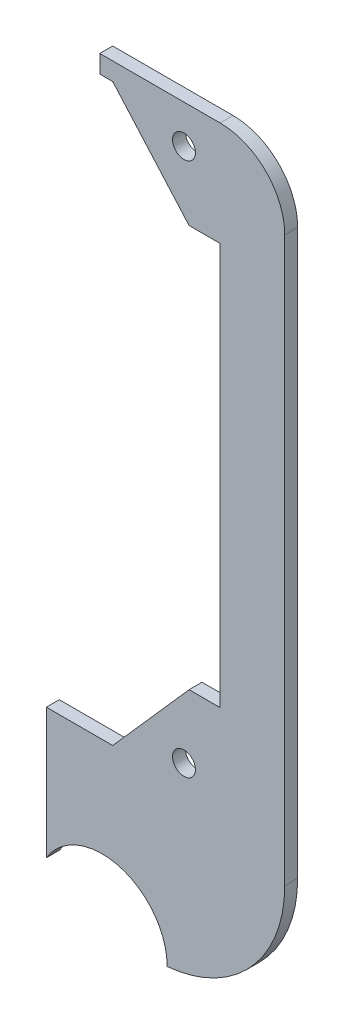
ISO-10303-21;
HEADER;
FILE_DESCRIPTION(('STEP AP214'),'2;1');
FILE_NAME('part.step','',(''),(''),'','','');
FILE_SCHEMA(('AUTOMOTIVE_DESIGN { 1 0 10303 214 1 1 1 1 }'));
ENDSEC;
DATA;
#1=APPLICATION_CONTEXT('core data for automotive mechanical design processes');
#2=APPLICATION_PROTOCOL_DEFINITION('international standard','automotive_design',2000,#1);
#3=PRODUCT_CONTEXT('',#1,'mechanical');
#4=PRODUCT('Part','Part','',(#3));
#5=PRODUCT_RELATED_PRODUCT_CATEGORY('part','',(#4));
#6=PRODUCT_DEFINITION_FORMATION('','',#4);
#7=PRODUCT_DEFINITION_CONTEXT('part definition',#1,'design');
#8=PRODUCT_DEFINITION('design','',#6,#7);
#9=PRODUCT_DEFINITION_SHAPE('','',#8);
#10=(LENGTH_UNIT() NAMED_UNIT(*) SI_UNIT(.MILLI.,.METRE.));
#11=(NAMED_UNIT(*) PLANE_ANGLE_UNIT() SI_UNIT($,.RADIAN.));
#12=(NAMED_UNIT(*) SI_UNIT($,.STERADIAN.) SOLID_ANGLE_UNIT());
#13=UNCERTAINTY_MEASURE_WITH_UNIT(LENGTH_MEASURE(1.E-05),#10,'distance_accuracy_value','');
#14=(GEOMETRIC_REPRESENTATION_CONTEXT(3) GLOBAL_UNCERTAINTY_ASSIGNED_CONTEXT((#13)) GLOBAL_UNIT_ASSIGNED_CONTEXT((#10,
#11,#12)) REPRESENTATION_CONTEXT('',''));
#15=CARTESIAN_POINT('',(0.,0.,0.));
#16=DIRECTION('',(0.,0.,1.));
#17=DIRECTION('',(1.,0.,0.));
#18=AXIS2_PLACEMENT_3D('',#15,#16,#17);
#19=CARTESIAN_POINT('',(-28.3531434966164,-28.9024348313696,2.54));
#20=DIRECTION('',(0.,0.,1.));
#21=DIRECTION('',(1.,0.,0.));
#22=AXIS2_PLACEMENT_3D('',#19,#20,#21);
#23=PLANE('',#22);
#24=CARTESIAN_POINT('',(-12.247498299296,7.37490825521719,2.54));
#25=DIRECTION('',(0.,0.,1.));
#26=DIRECTION('',(1.,0.,0.));
#27=AXIS2_PLACEMENT_3D('',#24,#25,#26);
#28=CIRCLE('',#27,2.25);
#29=CARTESIAN_POINT('',(-9.99749829929596,7.37490825521719,2.54));
#30=VERTEX_POINT('',#29);
#31=EDGE_CURVE('E244',#30,#30,#28,.T.);
#32=ORIENTED_EDGE('',*,*,#31,.F.);
#33=EDGE_LOOP('',(#32));
#34=FACE_BOUND('',#33,.T.);
#35=CARTESIAN_POINT('',(-28.3531434966164,-28.9024348313696,2.54));
#36=DIRECTION('',(0.,0.,-1.));
#37=DIRECTION('',(1.,0.,0.));
#38=AXIS2_PLACEMENT_3D('',#35,#36,#37);
#39=CIRCLE('',#38,12.8017722493406);
#40=CARTESIAN_POINT('',(-39.3002225086821,-22.2656559569774,2.54));
#41=VERTEX_POINT('',#40);
#42=CARTESIAN_POINT('',(-15.5513712472759,-28.9024348313696,2.54));
#43=VERTEX_POINT('',#42);
#44=EDGE_CURVE('E253',#41,#43,#39,.T.);
#45=ORIENTED_EDGE('',*,*,#44,.T.);
#46=CARTESIAN_POINT('',(-17.84749796,-3.60643115254483,2.54));
#47=DIRECTION('',(0.,0.,1.));
#48=DIRECTION('',(1.,0.,0.));
#49=AXIS2_PLACEMENT_3D('',#46,#47,#48);
#50=CIRCLE('',#49,25.4);
#51=CARTESIAN_POINT('',(7.55250203999997,-3.60643115254483,2.54));
#52=VERTEX_POINT('',#51);
#53=EDGE_CURVE('E11',#43,#52,#50,.T.);
#54=ORIENTED_EDGE('',*,*,#53,.T.);
#55=DIRECTION('',(0.,1.,0.));
#56=VECTOR('',#55,1.);
#57=CARTESIAN_POINT('',(7.55250203999997,119.888,2.54));
#58=LINE('',#57,#56);
#59=CARTESIAN_POINT('',(7.55250203999997,107.188,2.54));
#60=VERTEX_POINT('',#59);
#61=EDGE_CURVE('E251',#52,#60,#58,.T.);
#62=ORIENTED_EDGE('',*,*,#61,.T.);
#63=CARTESIAN_POINT('',(-5.14749796000003,107.188,2.54));
#64=DIRECTION('',(0.,0.,1.));
#65=DIRECTION('',(1.,0.,0.));
#66=AXIS2_PLACEMENT_3D('',#63,#64,#65);
#67=CIRCLE('',#66,12.7);
#68=CARTESIAN_POINT('',(-5.14749796000003,119.888,2.54));
#69=VERTEX_POINT('',#68);
#70=EDGE_CURVE('E170',#60,#69,#67,.T.);
#71=ORIENTED_EDGE('',*,*,#70,.T.);
#72=DIRECTION('',(-1.,0.,0.));
#73=VECTOR('',#72,1.);
#74=CARTESIAN_POINT('',(0.,119.888,2.54));
#75=LINE('',#74,#73);
#76=CARTESIAN_POINT('',(-28.8013191666399,119.888,2.54));
#77=VERTEX_POINT('',#76);
#78=EDGE_CURVE('E147',#69,#77,#75,.T.);
#79=ORIENTED_EDGE('',*,*,#78,.T.);
#80=DIRECTION('',(0.,-1.,0.));
#81=VECTOR('',#80,1.);
#82=CARTESIAN_POINT('',(-28.8013191666399,119.888,2.54));
#83=LINE('',#82,#81);
#84=CARTESIAN_POINT('',(-28.80131916664,116.374908255217,2.54));
#85=VERTEX_POINT('',#84);
#86=EDGE_CURVE('E142',#77,#85,#83,.T.);
#87=ORIENTED_EDGE('',*,*,#86,.T.);
#88=DIRECTION('',(1.,0.,0.));
#89=VECTOR('',#88,1.);
#90=CARTESIAN_POINT('',(-26.247498299296,116.374908255217,2.54));
#91=LINE('',#90,#89);
#92=CARTESIAN_POINT('',(-26.247498299296,116.374908255217,2.54));
#93=VERTEX_POINT('',#92);
#94=EDGE_CURVE('E132',#85,#93,#91,.T.);
#95=ORIENTED_EDGE('',*,*,#94,.T.);
#96=DIRECTION('',(0.661621637086846,-0.749837855365093,0.));
#97=VECTOR('',#96,1.);
#98=CARTESIAN_POINT('',(-11.247498299296,99.3749082552172,2.54));
#99=LINE('',#98,#97);
#100=CARTESIAN_POINT('',(-11.247498299296,99.3749082552172,2.54));
#101=VERTEX_POINT('',#100);
#102=EDGE_CURVE('E141',#93,#101,#99,.T.);
#103=ORIENTED_EDGE('',*,*,#102,.T.);
#104=DIRECTION('',(1.,0.,0.));
#105=VECTOR('',#104,1.);
#106=CARTESIAN_POINT('',(-5.14749829929598,99.3749082552172,2.54));
#107=LINE('',#106,#105);
#108=CARTESIAN_POINT('',(-5.14749829929598,99.3749082552172,2.54));
#109=VERTEX_POINT('',#108);
#110=EDGE_CURVE('E220',#101,#109,#107,.T.);
#111=ORIENTED_EDGE('',*,*,#110,.T.);
#112=DIRECTION('',(0.,-1.,0.));
#113=VECTOR('',#112,1.);
#114=CARTESIAN_POINT('',(-5.14749829929598,99.3749082552172,2.54));
#115=LINE('',#114,#113);
#116=CARTESIAN_POINT('',(-5.14749829929596,20.3749082552172,2.54));
#117=VERTEX_POINT('',#116);
#118=EDGE_CURVE('E263',#109,#117,#115,.T.);
#119=ORIENTED_EDGE('',*,*,#118,.T.);
#120=DIRECTION('',(-1.,0.,0.));
#121=VECTOR('',#120,1.);
#122=CARTESIAN_POINT('',(-5.14749829929596,20.3749082552172,2.54));
#123=LINE('',#122,#121);
#124=CARTESIAN_POINT('',(-11.247498299296,20.3749082552172,2.54));
#125=VERTEX_POINT('',#124);
#126=EDGE_CURVE('E261',#117,#125,#123,.T.);
#127=ORIENTED_EDGE('',*,*,#126,.T.);
#128=DIRECTION('',(-0.661621637086846,-0.749837855365093,0.));
#129=VECTOR('',#128,1.);
#130=CARTESIAN_POINT('',(-11.247498299296,20.3749082552172,2.54));
#131=LINE('',#130,#129);
#132=CARTESIAN_POINT('',(-26.247498299296,3.37490825521718,2.54));
#133=VERTEX_POINT('',#132);
#134=EDGE_CURVE('E259',#125,#133,#131,.T.);
#135=ORIENTED_EDGE('',*,*,#134,.T.);
#136=DIRECTION('',(-1.,0.,0.));
#137=VECTOR('',#136,1.);
#138=CARTESIAN_POINT('',(-26.247498299296,3.37490825521718,2.54));
#139=LINE('',#138,#137);
#140=CARTESIAN_POINT('',(-39.3002225086821,3.37490825521718,2.54));
#141=VERTEX_POINT('',#140);
#142=EDGE_CURVE('E257',#133,#141,#139,.T.);
#143=ORIENTED_EDGE('',*,*,#142,.T.);
#144=DIRECTION('',(0.,-1.,0.));
#145=VECTOR('',#144,1.);
#146=CARTESIAN_POINT('',(-39.3002225086821,3.37490825521718,2.54));
#147=LINE('',#146,#145);
#148=EDGE_CURVE('E255',#141,#41,#147,.T.);
#149=ORIENTED_EDGE('',*,*,#148,.T.);
#150=EDGE_LOOP('',(#45,#54,#62,#71,#79,#87,#95,#103,#111,#119,#127,#135,#143,#149));
#151=FACE_BOUND('',#150,.T.);
#152=CARTESIAN_POINT('',(-12.247498299296,112.374908255217,2.54));
#153=DIRECTION('',(0.,0.,1.));
#154=DIRECTION('',(1.,0.,0.));
#155=AXIS2_PLACEMENT_3D('',#152,#153,#154);
#156=CIRCLE('',#155,2.25);
#157=CARTESIAN_POINT('',(-9.99749829929596,112.374908255217,2.54));
#158=VERTEX_POINT('',#157);
#159=EDGE_CURVE('E268',#158,#158,#156,.T.);
#160=ORIENTED_EDGE('',*,*,#159,.F.);
#161=EDGE_LOOP('',(#160));
#162=FACE_BOUND('',#161,.T.);
#163=ADVANCED_FACE('F33',(#34,#151,#162),#23,.T.);
#164=CARTESIAN_POINT('',(-28.3531434966164,-28.9024348313696,0.));
#165=DIRECTION('',(0.,0.,1.));
#166=DIRECTION('',(1.,0.,0.));
#167=AXIS2_PLACEMENT_3D('',#164,#165,#166);
#168=PLANE('',#167);
#169=DIRECTION('',(0.,1.,0.));
#170=VECTOR('',#169,1.);
#171=CARTESIAN_POINT('',(7.55250203999997,119.888,0.));
#172=LINE('',#171,#170);
#173=CARTESIAN_POINT('',(7.55250203999997,-3.60643115254483,0.));
#174=VERTEX_POINT('',#173);
#175=CARTESIAN_POINT('',(7.55250203999997,107.188,0.));
#176=VERTEX_POINT('',#175);
#177=EDGE_CURVE('E181',#174,#176,#172,.T.);
#178=ORIENTED_EDGE('',*,*,#177,.F.);
#179=CARTESIAN_POINT('',(-17.84749796,-3.60643115254483,0.));
#180=DIRECTION('',(0.,0.,1.));
#181=DIRECTION('',(1.,0.,0.));
#182=AXIS2_PLACEMENT_3D('',#179,#180,#181);
#183=CIRCLE('',#182,25.4);
#184=CARTESIAN_POINT('',(-15.5513712472759,-28.9024348313696,0.));
#185=VERTEX_POINT('',#184);
#186=EDGE_CURVE('E41',#174,#185,#183,.F.);
#187=ORIENTED_EDGE('',*,*,#186,.T.);
#188=CARTESIAN_POINT('',(-28.3531434966164,-28.9024348313696,0.));
#189=DIRECTION('',(0.,0.,-1.));
#190=DIRECTION('',(1.,0.,0.));
#191=AXIS2_PLACEMENT_3D('',#188,#189,#190);
#192=CIRCLE('',#191,12.8017722493406);
#193=CARTESIAN_POINT('',(-39.3002225086821,-22.2656559569774,0.));
#194=VERTEX_POINT('',#193);
#195=EDGE_CURVE('E180',#194,#185,#192,.T.);
#196=ORIENTED_EDGE('',*,*,#195,.F.);
#197=DIRECTION('',(0.,-1.,0.));
#198=VECTOR('',#197,1.);
#199=CARTESIAN_POINT('',(-39.3002225086821,3.37490825521718,0.));
#200=LINE('',#199,#198);
#201=CARTESIAN_POINT('',(-39.3002225086821,3.37490825521718,0.));
#202=VERTEX_POINT('',#201);
#203=EDGE_CURVE('E190',#202,#194,#200,.T.);
#204=ORIENTED_EDGE('',*,*,#203,.F.);
#205=DIRECTION('',(-1.,0.,0.));
#206=VECTOR('',#205,1.);
#207=CARTESIAN_POINT('',(-26.247498299296,3.37490825521718,0.));
#208=LINE('',#207,#206);
#209=CARTESIAN_POINT('',(-26.247498299296,3.37490825521718,0.));
#210=VERTEX_POINT('',#209);
#211=EDGE_CURVE('E237',#210,#202,#208,.T.);
#212=ORIENTED_EDGE('',*,*,#211,.F.);
#213=DIRECTION('',(-0.661621637086846,-0.749837855365093,0.));
#214=VECTOR('',#213,1.);
#215=CARTESIAN_POINT('',(-11.247498299296,20.3749082552172,0.));
#216=LINE('',#215,#214);
#217=CARTESIAN_POINT('',(-11.247498299296,20.3749082552172,0.));
#218=VERTEX_POINT('',#217);
#219=EDGE_CURVE('E235',#218,#210,#216,.T.);
#220=ORIENTED_EDGE('',*,*,#219,.F.);
#221=DIRECTION('',(-1.,0.,0.));
#222=VECTOR('',#221,1.);
#223=CARTESIAN_POINT('',(-5.14749829929596,20.3749082552172,0.));
#224=LINE('',#223,#222);
#225=CARTESIAN_POINT('',(-5.14749829929596,20.3749082552172,0.));
#226=VERTEX_POINT('',#225);
#227=EDGE_CURVE('E228',#226,#218,#224,.T.);
#228=ORIENTED_EDGE('',*,*,#227,.F.);
#229=DIRECTION('',(0.,-1.,0.));
#230=VECTOR('',#229,1.);
#231=CARTESIAN_POINT('',(-5.14749829929598,99.3749082552172,0.));
#232=LINE('',#231,#230);
#233=CARTESIAN_POINT('',(-5.14749829929598,99.3749082552172,0.));
#234=VERTEX_POINT('',#233);
#235=EDGE_CURVE('E226',#234,#226,#232,.T.);
#236=ORIENTED_EDGE('',*,*,#235,.F.);
#237=DIRECTION('',(1.,0.,0.));
#238=VECTOR('',#237,1.);
#239=CARTESIAN_POINT('',(-5.14749829929598,99.3749082552172,0.));
#240=LINE('',#239,#238);
#241=CARTESIAN_POINT('',(-11.247498299296,99.3749082552172,0.));
#242=VERTEX_POINT('',#241);
#243=EDGE_CURVE('E219',#242,#234,#240,.T.);
#244=ORIENTED_EDGE('',*,*,#243,.F.);
#245=DIRECTION('',(0.661621637086846,-0.749837855365093,0.));
#246=VECTOR('',#245,1.);
#247=CARTESIAN_POINT('',(-11.247498299296,99.3749082552172,0.));
#248=LINE('',#247,#246);
#249=CARTESIAN_POINT('',(-26.247498299296,116.374908255217,0.));
#250=VERTEX_POINT('',#249);
#251=EDGE_CURVE('E224',#250,#242,#248,.T.);
#252=ORIENTED_EDGE('',*,*,#251,.F.);
#253=DIRECTION('',(1.,0.,0.));
#254=VECTOR('',#253,1.);
#255=CARTESIAN_POINT('',(-26.247498299296,116.374908255217,0.));
#256=LINE('',#255,#254);
#257=CARTESIAN_POINT('',(-28.80131916664,116.374908255217,0.));
#258=VERTEX_POINT('',#257);
#259=EDGE_CURVE('E230',#258,#250,#256,.T.);
#260=ORIENTED_EDGE('',*,*,#259,.F.);
#261=DIRECTION('',(0.,-1.,0.));
#262=VECTOR('',#261,1.);
#263=CARTESIAN_POINT('',(-28.8013191666399,119.888,0.));
#264=LINE('',#263,#262);
#265=CARTESIAN_POINT('',(-28.8013191666399,119.888,0.));
#266=VERTEX_POINT('',#265);
#267=EDGE_CURVE('E155',#266,#258,#264,.T.);
#268=ORIENTED_EDGE('',*,*,#267,.F.);
#269=DIRECTION('',(-1.,0.,0.));
#270=VECTOR('',#269,1.);
#271=CARTESIAN_POINT('',(0.,119.888,0.));
#272=LINE('',#271,#270);
#273=CARTESIAN_POINT('',(-5.14749796000003,119.888,0.));
#274=VERTEX_POINT('',#273);
#275=EDGE_CURVE('E151',#274,#266,#272,.T.);
#276=ORIENTED_EDGE('',*,*,#275,.F.);
#277=CARTESIAN_POINT('',(-5.14749796000003,107.188,0.));
#278=DIRECTION('',(0.,0.,1.));
#279=DIRECTION('',(1.,0.,0.));
#280=AXIS2_PLACEMENT_3D('',#277,#278,#279);
#281=CIRCLE('',#280,12.7);
#282=EDGE_CURVE('E159',#274,#176,#281,.F.);
#283=ORIENTED_EDGE('',*,*,#282,.T.);
#284=EDGE_LOOP('',(#178,#187,#196,#204,#212,#220,#228,#236,#244,#252,#260,#268,#276,#283));
#285=FACE_BOUND('',#284,.T.);
#286=CARTESIAN_POINT('',(-12.247498299296,7.37490825521719,0.));
#287=DIRECTION('',(0.,0.,1.));
#288=DIRECTION('',(1.,0.,0.));
#289=AXIS2_PLACEMENT_3D('',#286,#287,#288);
#290=CIRCLE('',#289,2.25);
#291=CARTESIAN_POINT('',(-9.99749829929596,7.37490825521719,0.));
#292=VERTEX_POINT('',#291);
#293=EDGE_CURVE('E247',#292,#292,#290,.T.);
#294=ORIENTED_EDGE('',*,*,#293,.T.);
#295=EDGE_LOOP('',(#294));
#296=FACE_BOUND('',#295,.T.);
#297=CARTESIAN_POINT('',(-12.247498299296,112.374908255217,0.));
#298=DIRECTION('',(0.,0.,1.));
#299=DIRECTION('',(1.,0.,0.));
#300=AXIS2_PLACEMENT_3D('',#297,#298,#299);
#301=CIRCLE('',#300,2.25);
#302=CARTESIAN_POINT('',(-9.99749829929596,112.374908255217,0.));
#303=VERTEX_POINT('',#302);
#304=EDGE_CURVE('E270',#303,#303,#301,.T.);
#305=ORIENTED_EDGE('',*,*,#304,.T.);
#306=EDGE_LOOP('',(#305));
#307=FACE_BOUND('',#306,.T.);
#308=ADVANCED_FACE('F177',(#285,#296,#307),#168,.F.);
#309=CARTESIAN_POINT('',(-28.8013191666399,119.888,2.54));
#310=DIRECTION('',(1.,0.,0.));
#311=DIRECTION('',(0.,1.,0.));
#312=AXIS2_PLACEMENT_3D('',#309,#310,#311);
#313=PLANE('',#312);
#314=ORIENTED_EDGE('',*,*,#267,.T.);
#315=DIRECTION('',(0.,0.,-1.));
#316=VECTOR('',#315,1.);
#317=CARTESIAN_POINT('',(-28.80131916664,116.374908255217,2.54));
#318=LINE('',#317,#316);
#319=EDGE_CURVE('E136',#85,#258,#318,.T.);
#320=ORIENTED_EDGE('',*,*,#319,.F.);
#321=ORIENTED_EDGE('',*,*,#86,.F.);
#322=DIRECTION('',(0.,0.,-1.));
#323=VECTOR('',#322,1.);
#324=CARTESIAN_POINT('',(-28.8013191666399,119.888,2.54));
#325=LINE('',#324,#323);
#326=EDGE_CURVE('E192',#77,#266,#325,.T.);
#327=ORIENTED_EDGE('',*,*,#326,.T.);
#328=EDGE_LOOP('',(#314,#320,#321,#327));
#329=FACE_BOUND('',#328,.T.);
#330=ADVANCED_FACE('F153',(#329),#313,.F.);
#331=CARTESIAN_POINT('',(-26.247498299296,116.374908255217,2.54));
#332=DIRECTION('',(0.,1.,0.));
#333=DIRECTION('',(0.,0.,1.));
#334=AXIS2_PLACEMENT_3D('',#331,#332,#333);
#335=PLANE('',#334);
#336=ORIENTED_EDGE('',*,*,#259,.T.);
#337=DIRECTION('',(0.,0.,-1.));
#338=VECTOR('',#337,1.);
#339=CARTESIAN_POINT('',(-26.247498299296,116.374908255217,2.54));
#340=LINE('',#339,#338);
#341=EDGE_CURVE('E139',#93,#250,#340,.T.);
#342=ORIENTED_EDGE('',*,*,#341,.F.);
#343=ORIENTED_EDGE('',*,*,#94,.F.);
#344=ORIENTED_EDGE('',*,*,#319,.T.);
#345=EDGE_LOOP('',(#336,#342,#343,#344));
#346=FACE_BOUND('',#345,.T.);
#347=ADVANCED_FACE('F134',(#346),#335,.F.);
#348=CARTESIAN_POINT('',(-11.247498299296,99.3749082552172,2.54));
#349=DIRECTION('',(0.749837855365093,0.661621637086846,0.));
#350=DIRECTION('',(-0.661621637086846,0.749837855365093,0.));
#351=AXIS2_PLACEMENT_3D('',#348,#349,#350);
#352=PLANE('',#351);
#353=ORIENTED_EDGE('',*,*,#251,.T.);
#354=DIRECTION('',(0.,0.,-1.));
#355=VECTOR('',#354,1.);
#356=CARTESIAN_POINT('',(-11.247498299296,99.3749082552172,2.54));
#357=LINE('',#356,#355);
#358=EDGE_CURVE('E161',#101,#242,#357,.T.);
#359=ORIENTED_EDGE('',*,*,#358,.F.);
#360=ORIENTED_EDGE('',*,*,#102,.F.);
#361=ORIENTED_EDGE('',*,*,#341,.T.);
#362=EDGE_LOOP('',(#353,#359,#360,#361));
#363=FACE_BOUND('',#362,.T.);
#364=ADVANCED_FACE('F320',(#363),#352,.F.);
#365=CARTESIAN_POINT('',(-5.14749829929598,99.3749082552172,2.54));
#366=DIRECTION('',(0.,1.,0.));
#367=DIRECTION('',(0.,0.,1.));
#368=AXIS2_PLACEMENT_3D('',#365,#366,#367);
#369=PLANE('',#368);
#370=ORIENTED_EDGE('',*,*,#243,.T.);
#371=DIRECTION('',(0.,0.,-1.));
#372=VECTOR('',#371,1.);
#373=CARTESIAN_POINT('',(-5.14749829929598,99.3749082552172,2.54));
#374=LINE('',#373,#372);
#375=EDGE_CURVE('E210',#109,#234,#374,.T.);
#376=ORIENTED_EDGE('',*,*,#375,.F.);
#377=ORIENTED_EDGE('',*,*,#110,.F.);
#378=ORIENTED_EDGE('',*,*,#358,.T.);
#379=EDGE_LOOP('',(#370,#376,#377,#378));
#380=FACE_BOUND('',#379,.T.);
#381=ADVANCED_FACE('F217',(#380),#369,.F.);
#382=CARTESIAN_POINT('',(-5.14749829929598,99.3749082552172,2.54));
#383=DIRECTION('',(1.,0.,0.));
#384=DIRECTION('',(0.,1.,0.));
#385=AXIS2_PLACEMENT_3D('',#382,#383,#384);
#386=PLANE('',#385);
#387=ORIENTED_EDGE('',*,*,#235,.T.);
#388=DIRECTION('',(0.,0.,-1.));
#389=VECTOR('',#388,1.);
#390=CARTESIAN_POINT('',(-5.14749829929596,20.3749082552172,2.54));
#391=LINE('',#390,#389);
#392=EDGE_CURVE('E207',#117,#226,#391,.T.);
#393=ORIENTED_EDGE('',*,*,#392,.F.);
#394=ORIENTED_EDGE('',*,*,#118,.F.);
#395=ORIENTED_EDGE('',*,*,#375,.T.);
#396=EDGE_LOOP('',(#387,#393,#394,#395));
#397=FACE_BOUND('',#396,.T.);
#398=ADVANCED_FACE('F313',(#397),#386,.F.);
#399=CARTESIAN_POINT('',(-5.14749829929596,20.3749082552172,2.54));
#400=DIRECTION('',(0.,-1.,0.));
#401=DIRECTION('',(0.,0.,-1.));
#402=AXIS2_PLACEMENT_3D('',#399,#400,#401);
#403=PLANE('',#402);
#404=ORIENTED_EDGE('',*,*,#227,.T.);
#405=DIRECTION('',(0.,0.,-1.));
#406=VECTOR('',#405,1.);
#407=CARTESIAN_POINT('',(-11.247498299296,20.3749082552172,2.54));
#408=LINE('',#407,#406);
#409=EDGE_CURVE('E204',#125,#218,#408,.T.);
#410=ORIENTED_EDGE('',*,*,#409,.F.);
#411=ORIENTED_EDGE('',*,*,#126,.F.);
#412=ORIENTED_EDGE('',*,*,#392,.T.);
#413=EDGE_LOOP('',(#404,#410,#411,#412));
#414=FACE_BOUND('',#413,.T.);
#415=ADVANCED_FACE('F309',(#414),#403,.F.);
#416=CARTESIAN_POINT('',(-11.247498299296,20.3749082552172,2.54));
#417=DIRECTION('',(0.749837855365093,-0.661621637086846,0.));
#418=DIRECTION('',(0.661621637086846,0.749837855365093,0.));
#419=AXIS2_PLACEMENT_3D('',#416,#417,#418);
#420=PLANE('',#419);
#421=ORIENTED_EDGE('',*,*,#219,.T.);
#422=DIRECTION('',(0.,0.,-1.));
#423=VECTOR('',#422,1.);
#424=CARTESIAN_POINT('',(-26.247498299296,3.37490825521718,2.54));
#425=LINE('',#424,#423);
#426=EDGE_CURVE('E201',#133,#210,#425,.T.);
#427=ORIENTED_EDGE('',*,*,#426,.F.);
#428=ORIENTED_EDGE('',*,*,#134,.F.);
#429=ORIENTED_EDGE('',*,*,#409,.T.);
#430=EDGE_LOOP('',(#421,#427,#428,#429));
#431=FACE_BOUND('',#430,.T.);
#432=ADVANCED_FACE('F305',(#431),#420,.F.);
#433=CARTESIAN_POINT('',(-26.247498299296,3.37490825521718,2.54));
#434=DIRECTION('',(0.,-1.,0.));
#435=DIRECTION('',(1.,0.,0.));
#436=AXIS2_PLACEMENT_3D('',#433,#434,#435);
#437=PLANE('',#436);
#438=ORIENTED_EDGE('',*,*,#211,.T.);
#439=DIRECTION('',(0.,0.,-1.));
#440=VECTOR('',#439,1.);
#441=CARTESIAN_POINT('',(-39.3002225086821,3.37490825521718,2.54));
#442=LINE('',#441,#440);
#443=EDGE_CURVE('E194',#141,#202,#442,.T.);
#444=ORIENTED_EDGE('',*,*,#443,.F.);
#445=ORIENTED_EDGE('',*,*,#142,.F.);
#446=ORIENTED_EDGE('',*,*,#426,.T.);
#447=EDGE_LOOP('',(#438,#444,#445,#446));
#448=FACE_BOUND('',#447,.T.);
#449=ADVANCED_FACE('F301',(#448),#437,.F.);
#450=CARTESIAN_POINT('',(-39.3002225086821,3.37490825521718,2.54));
#451=DIRECTION('',(1.,0.,0.));
#452=DIRECTION('',(0.,0.,-1.));
#453=AXIS2_PLACEMENT_3D('',#450,#451,#452);
#454=PLANE('',#453);
#455=ORIENTED_EDGE('',*,*,#203,.T.);
#456=DIRECTION('',(0.,0.,-1.));
#457=VECTOR('',#456,1.);
#458=CARTESIAN_POINT('',(-39.3002225086821,-22.2656559569774,2.54));
#459=LINE('',#458,#457);
#460=EDGE_CURVE('E189',#41,#194,#459,.T.);
#461=ORIENTED_EDGE('',*,*,#460,.F.);
#462=ORIENTED_EDGE('',*,*,#148,.F.);
#463=ORIENTED_EDGE('',*,*,#443,.T.);
#464=EDGE_LOOP('',(#455,#461,#462,#463));
#465=FACE_BOUND('',#464,.T.);
#466=ADVANCED_FACE('F298',(#465),#454,.F.);
#467=CARTESIAN_POINT('',(-28.3531434966164,-28.9024348313696,2.54));
#468=DIRECTION('',(0.,0.,-1.));
#469=DIRECTION('',(-1.,0.,0.));
#470=AXIS2_PLACEMENT_3D('',#467,#468,#469);
#471=CYLINDRICAL_SURFACE('',#470,12.8017722493406);
#472=ORIENTED_EDGE('',*,*,#195,.T.);
#473=DIRECTION('',(0.,0.,-1.));
#474=VECTOR('',#473,1.);
#475=CARTESIAN_POINT('',(-15.5513712472759,-28.9024348313696,2.54));
#476=LINE('',#475,#474);
#477=EDGE_CURVE('E187',#43,#185,#476,.T.);
#478=ORIENTED_EDGE('',*,*,#477,.F.);
#479=ORIENTED_EDGE('',*,*,#44,.F.);
#480=ORIENTED_EDGE('',*,*,#460,.T.);
#481=EDGE_LOOP('',(#472,#478,#479,#480));
#482=FACE_BOUND('',#481,.T.);
#483=ADVANCED_FACE('F185',(#482),#471,.F.);
#484=CARTESIAN_POINT('',(7.55250203999997,119.888,2.54));
#485=DIRECTION('',(-1.,0.,0.));
#486=DIRECTION('',(0.,0.,1.));
#487=AXIS2_PLACEMENT_3D('',#484,#485,#486);
#488=PLANE('',#487);
#489=ORIENTED_EDGE('',*,*,#61,.F.);
#490=DIRECTION('',(0.,0.,-1.));
#491=VECTOR('',#490,1.);
#492=CARTESIAN_POINT('',(7.55250203999997,-3.60643115254483,2.54));
#493=LINE('',#492,#491);
#494=EDGE_CURVE('E172',#52,#174,#493,.T.);
#495=ORIENTED_EDGE('',*,*,#494,.T.);
#496=ORIENTED_EDGE('',*,*,#177,.T.);
#497=DIRECTION('',(0.,0.,-1.));
#498=VECTOR('',#497,1.);
#499=CARTESIAN_POINT('',(7.55250203999997,107.188,2.54));
#500=LINE('',#499,#498);
#501=EDGE_CURVE('E167',#176,#60,#500,.F.);
#502=ORIENTED_EDGE('',*,*,#501,.T.);
#503=EDGE_LOOP('',(#489,#495,#496,#502));
#504=FACE_BOUND('',#503,.T.);
#505=ADVANCED_FACE('F292',(#504),#488,.F.);
#506=CARTESIAN_POINT('',(0.,119.888,2.54));
#507=DIRECTION('',(0.,-1.,0.));
#508=DIRECTION('',(0.,0.,-1.));
#509=AXIS2_PLACEMENT_3D('',#506,#507,#508);
#510=PLANE('',#509);
#511=ORIENTED_EDGE('',*,*,#78,.F.);
#512=DIRECTION('',(0.,0.,-1.));
#513=VECTOR('',#512,1.);
#514=CARTESIAN_POINT('',(-5.14749796000003,119.888,2.54));
#515=LINE('',#514,#513);
#516=EDGE_CURVE('E156',#69,#274,#515,.T.);
#517=ORIENTED_EDGE('',*,*,#516,.T.);
#518=ORIENTED_EDGE('',*,*,#275,.T.);
#519=ORIENTED_EDGE('',*,*,#326,.F.);
#520=EDGE_LOOP('',(#511,#517,#518,#519));
#521=FACE_BOUND('',#520,.T.);
#522=ADVANCED_FACE('F242',(#521),#510,.F.);
#523=CARTESIAN_POINT('',(-12.247498299296,7.37490825521719,2.54));
#524=DIRECTION('',(0.,0.,-1.));
#525=DIRECTION('',(-1.,0.,0.));
#526=AXIS2_PLACEMENT_3D('',#523,#524,#525);
#527=CYLINDRICAL_SURFACE('',#526,2.25);
#528=ORIENTED_EDGE('',*,*,#31,.T.);
#529=EDGE_LOOP('',(#528));
#530=FACE_BOUND('',#529,.T.);
#531=ORIENTED_EDGE('',*,*,#293,.F.);
#532=EDGE_LOOP('',(#531));
#533=FACE_BOUND('',#532,.T.);
#534=ADVANCED_FACE('F287',(#530,#533),#527,.F.);
#535=CARTESIAN_POINT('',(-12.247498299296,112.374908255217,2.54));
#536=DIRECTION('',(0.,0.,-1.));
#537=DIRECTION('',(-1.,0.,0.));
#538=AXIS2_PLACEMENT_3D('',#535,#536,#537);
#539=CYLINDRICAL_SURFACE('',#538,2.25);
#540=ORIENTED_EDGE('',*,*,#159,.T.);
#541=EDGE_LOOP('',(#540));
#542=FACE_BOUND('',#541,.T.);
#543=ORIENTED_EDGE('',*,*,#304,.F.);
#544=EDGE_LOOP('',(#543));
#545=FACE_BOUND('',#544,.T.);
#546=ADVANCED_FACE('F276',(#542,#545),#539,.F.);
#547=CARTESIAN_POINT('',(-5.14749796000003,107.188,2.54));
#548=DIRECTION('',(0.,0.,-1.));
#549=DIRECTION('',(-1.,0.,0.));
#550=AXIS2_PLACEMENT_3D('',#547,#548,#549);
#551=CYLINDRICAL_SURFACE('',#550,12.7);
#552=ORIENTED_EDGE('',*,*,#70,.F.);
#553=ORIENTED_EDGE('',*,*,#501,.F.);
#554=ORIENTED_EDGE('',*,*,#282,.F.);
#555=ORIENTED_EDGE('',*,*,#516,.F.);
#556=EDGE_LOOP('',(#552,#553,#554,#555));
#557=FACE_BOUND('',#556,.T.);
#558=ADVANCED_FACE('F326',(#557),#551,.T.);
#559=CARTESIAN_POINT('',(-17.84749796,-3.60643115254483,2.54));
#560=DIRECTION('',(0.,0.,-1.));
#561=DIRECTION('',(-1.,0.,0.));
#562=AXIS2_PLACEMENT_3D('',#559,#560,#561);
#563=CYLINDRICAL_SURFACE('',#562,25.4);
#564=ORIENTED_EDGE('',*,*,#53,.F.);
#565=ORIENTED_EDGE('',*,*,#477,.T.);
#566=ORIENTED_EDGE('',*,*,#186,.F.);
#567=ORIENTED_EDGE('',*,*,#494,.F.);
#568=EDGE_LOOP('',(#564,#565,#566,#567));
#569=FACE_BOUND('',#568,.T.);
#570=ADVANCED_FACE('F35',(#569),#563,.T.);
#571=CLOSED_SHELL('',(#163,#308,#330,#347,#364,#381,#398,#415,#432,#449,#466,#483,#505,#522,
#534,#546,#558,#570));
#572=MANIFOLD_SOLID_BREP('B2',#571);
#573=ADVANCED_BREP_SHAPE_REPRESENTATION('',(#18,#572),#14);
#574=SHAPE_DEFINITION_REPRESENTATION(#9,#573);
ENDSEC;
END-ISO-10303-21;
